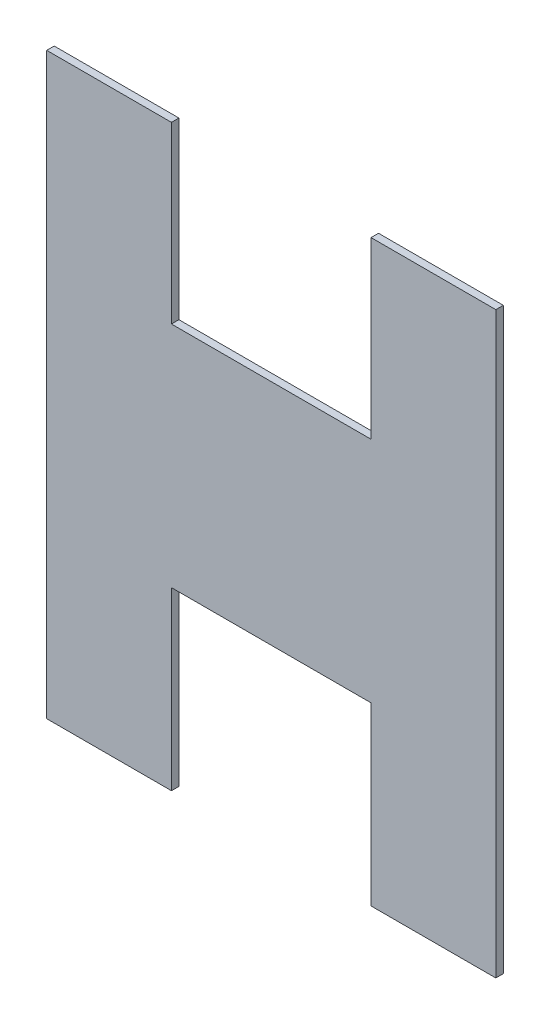
ISO-10303-21;
HEADER;
FILE_DESCRIPTION(('STEP AP214'),'2;1');
FILE_NAME('part.step','',(''),(''),'','','');
FILE_SCHEMA(('AUTOMOTIVE_DESIGN { 1 0 10303 214 1 1 1 1 }'));
ENDSEC;
DATA;
#1=APPLICATION_CONTEXT('core data for automotive mechanical design processes');
#2=APPLICATION_PROTOCOL_DEFINITION('international standard','automotive_design',2000,#1);
#3=PRODUCT_CONTEXT('',#1,'mechanical');
#4=PRODUCT('Part','Part','',(#3));
#5=PRODUCT_RELATED_PRODUCT_CATEGORY('part','',(#4));
#6=PRODUCT_DEFINITION_FORMATION('','',#4);
#7=PRODUCT_DEFINITION_CONTEXT('part definition',#1,'design');
#8=PRODUCT_DEFINITION('design','',#6,#7);
#9=PRODUCT_DEFINITION_SHAPE('','',#8);
#10=(LENGTH_UNIT() NAMED_UNIT(*) SI_UNIT(.MILLI.,.METRE.));
#11=(NAMED_UNIT(*) PLANE_ANGLE_UNIT() SI_UNIT($,.RADIAN.));
#12=(NAMED_UNIT(*) SI_UNIT($,.STERADIAN.) SOLID_ANGLE_UNIT());
#13=UNCERTAINTY_MEASURE_WITH_UNIT(LENGTH_MEASURE(1.E-05),#10,'distance_accuracy_value','');
#14=(GEOMETRIC_REPRESENTATION_CONTEXT(3) GLOBAL_UNCERTAINTY_ASSIGNED_CONTEXT((#13)) GLOBAL_UNIT_ASSIGNED_CONTEXT((#10,
#11,#12)) REPRESENTATION_CONTEXT('',''));
#15=CARTESIAN_POINT('',(0.,0.,0.));
#16=DIRECTION('',(0.,0.,1.));
#17=DIRECTION('',(1.,0.,0.));
#18=AXIS2_PLACEMENT_3D('',#15,#16,#17);
#19=CARTESIAN_POINT('',(40.,83.2564363110963,3.));
#20=DIRECTION('',(0.,-1.,0.));
#21=DIRECTION('',(1.,0.,0.));
#22=AXIS2_PLACEMENT_3D('',#19,#20,#21);
#23=PLANE('',#22);
#24=DIRECTION('',(-1.,0.,0.));
#25=VECTOR('',#24,1.);
#26=CARTESIAN_POINT('',(40.,83.2564363110963,0.));
#27=LINE('',#26,#25);
#28=CARTESIAN_POINT('',(90.,83.2564363110963,0.));
#29=VERTEX_POINT('',#28);
#30=CARTESIAN_POINT('',(40.,83.2564363110963,0.));
#31=VERTEX_POINT('',#30);
#32=EDGE_CURVE('E153',#29,#31,#27,.T.);
#33=ORIENTED_EDGE('',*,*,#32,.T.);
#34=DIRECTION('',(0.,0.,-1.));
#35=VECTOR('',#34,1.);
#36=CARTESIAN_POINT('',(40.,83.2564363110963,3.));
#37=LINE('',#36,#35);
#38=CARTESIAN_POINT('',(40.,83.2564363110963,3.));
#39=VERTEX_POINT('',#38);
#40=EDGE_CURVE('E11',#39,#31,#37,.T.);
#41=ORIENTED_EDGE('',*,*,#40,.F.);
#42=DIRECTION('',(-1.,0.,0.));
#43=VECTOR('',#42,1.);
#44=CARTESIAN_POINT('',(40.,83.2564363110963,3.));
#45=LINE('',#44,#43);
#46=CARTESIAN_POINT('',(90.,83.2564363110963,3.));
#47=VERTEX_POINT('',#46);
#48=EDGE_CURVE('E175',#47,#39,#45,.T.);
#49=ORIENTED_EDGE('',*,*,#48,.F.);
#50=DIRECTION('',(0.,0.,-1.));
#51=VECTOR('',#50,1.);
#52=CARTESIAN_POINT('',(90.,83.2564363110963,3.));
#53=LINE('',#52,#51);
#54=EDGE_CURVE('E149',#47,#29,#53,.T.);
#55=ORIENTED_EDGE('',*,*,#54,.T.);
#56=EDGE_LOOP('',(#33,#41,#49,#55));
#57=FACE_BOUND('',#56,.T.);
#58=ADVANCED_FACE('F33',(#57),#23,.F.);
#59=CARTESIAN_POINT('',(40.,13.2564363110963,3.));
#60=DIRECTION('',(1.,0.,0.));
#61=DIRECTION('',(0.,0.,-1.));
#62=AXIS2_PLACEMENT_3D('',#59,#60,#61);
#63=PLANE('',#62);
#64=DIRECTION('',(0.,-1.,0.));
#65=VECTOR('',#64,1.);
#66=CARTESIAN_POINT('',(40.,13.2564363110963,0.));
#67=LINE('',#66,#65);
#68=CARTESIAN_POINT('',(40.,13.2564363110963,0.));
#69=VERTEX_POINT('',#68);
#70=EDGE_CURVE('E156',#31,#69,#67,.T.);
#71=ORIENTED_EDGE('',*,*,#70,.T.);
#72=DIRECTION('',(0.,0.,-1.));
#73=VECTOR('',#72,1.);
#74=CARTESIAN_POINT('',(40.,13.2564363110963,3.));
#75=LINE('',#74,#73);
#76=CARTESIAN_POINT('',(40.,13.2564363110963,3.));
#77=VERTEX_POINT('',#76);
#78=EDGE_CURVE('E41',#77,#69,#75,.T.);
#79=ORIENTED_EDGE('',*,*,#78,.F.);
#80=DIRECTION('',(0.,-1.,0.));
#81=VECTOR('',#80,1.);
#82=CARTESIAN_POINT('',(40.,13.2564363110963,3.));
#83=LINE('',#82,#81);
#84=EDGE_CURVE('E104',#39,#77,#83,.T.);
#85=ORIENTED_EDGE('',*,*,#84,.F.);
#86=ORIENTED_EDGE('',*,*,#40,.T.);
#87=EDGE_LOOP('',(#71,#79,#85,#86));
#88=FACE_BOUND('',#87,.T.);
#89=ADVANCED_FACE('F253',(#88),#63,.F.);
#90=CARTESIAN_POINT('',(-40.,13.2564363110963,3.));
#91=DIRECTION('',(0.,-1.,0.));
#92=DIRECTION('',(0.,0.,-1.));
#93=AXIS2_PLACEMENT_3D('',#90,#91,#92);
#94=PLANE('',#93);
#95=DIRECTION('',(-1.,0.,0.));
#96=VECTOR('',#95,1.);
#97=CARTESIAN_POINT('',(-40.,13.2564363110963,0.));
#98=LINE('',#97,#96);
#99=CARTESIAN_POINT('',(-40.,13.2564363110963,0.));
#100=VERTEX_POINT('',#99);
#101=EDGE_CURVE('E158',#69,#100,#98,.T.);
#102=ORIENTED_EDGE('',*,*,#101,.T.);
#103=DIRECTION('',(0.,0.,-1.));
#104=VECTOR('',#103,1.);
#105=CARTESIAN_POINT('',(-40.,13.2564363110963,3.));
#106=LINE('',#105,#104);
#107=CARTESIAN_POINT('',(-40.,13.2564363110963,3.));
#108=VERTEX_POINT('',#107);
#109=EDGE_CURVE('E194',#108,#100,#106,.T.);
#110=ORIENTED_EDGE('',*,*,#109,.F.);
#111=DIRECTION('',(-1.,0.,0.));
#112=VECTOR('',#111,1.);
#113=CARTESIAN_POINT('',(-40.,13.2564363110963,3.));
#114=LINE('',#113,#112);
#115=EDGE_CURVE('E202',#77,#108,#114,.T.);
#116=ORIENTED_EDGE('',*,*,#115,.F.);
#117=ORIENTED_EDGE('',*,*,#78,.T.);
#118=EDGE_LOOP('',(#102,#110,#116,#117));
#119=FACE_BOUND('',#118,.T.);
#120=ADVANCED_FACE('F200',(#119),#94,.F.);
#121=CARTESIAN_POINT('',(-40.,83.2564363110963,3.));
#122=DIRECTION('',(-1.,0.,0.));
#123=DIRECTION('',(0.,0.,1.));
#124=AXIS2_PLACEMENT_3D('',#121,#122,#123);
#125=PLANE('',#124);
#126=DIRECTION('',(0.,1.,0.));
#127=VECTOR('',#126,1.);
#128=CARTESIAN_POINT('',(-40.,83.2564363110963,0.));
#129=LINE('',#128,#127);
#130=CARTESIAN_POINT('',(-40.,83.2564363110963,0.));
#131=VERTEX_POINT('',#130);
#132=EDGE_CURVE('E160',#100,#131,#129,.T.);
#133=ORIENTED_EDGE('',*,*,#132,.T.);
#134=DIRECTION('',(0.,0.,-1.));
#135=VECTOR('',#134,1.);
#136=CARTESIAN_POINT('',(-40.,83.2564363110963,3.));
#137=LINE('',#136,#135);
#138=CARTESIAN_POINT('',(-40.,83.2564363110963,3.));
#139=VERTEX_POINT('',#138);
#140=EDGE_CURVE('E191',#139,#131,#137,.T.);
#141=ORIENTED_EDGE('',*,*,#140,.F.);
#142=DIRECTION('',(0.,1.,0.));
#143=VECTOR('',#142,1.);
#144=CARTESIAN_POINT('',(-40.,83.2564363110963,3.));
#145=LINE('',#144,#143);
#146=EDGE_CURVE('E220',#108,#139,#145,.T.);
#147=ORIENTED_EDGE('',*,*,#146,.F.);
#148=ORIENTED_EDGE('',*,*,#109,.T.);
#149=EDGE_LOOP('',(#133,#141,#147,#148));
#150=FACE_BOUND('',#149,.T.);
#151=ADVANCED_FACE('F211',(#150),#125,.F.);
#152=CARTESIAN_POINT('',(-90.,83.2564363110963,3.));
#153=DIRECTION('',(0.,-1.,0.));
#154=DIRECTION('',(1.,0.,0.));
#155=AXIS2_PLACEMENT_3D('',#152,#153,#154);
#156=PLANE('',#155);
#157=DIRECTION('',(-1.,0.,0.));
#158=VECTOR('',#157,1.);
#159=CARTESIAN_POINT('',(-90.,83.2564363110963,0.));
#160=LINE('',#159,#158);
#161=CARTESIAN_POINT('',(-90.,83.2564363110963,0.));
#162=VERTEX_POINT('',#161);
#163=EDGE_CURVE('E162',#131,#162,#160,.T.);
#164=ORIENTED_EDGE('',*,*,#163,.T.);
#165=DIRECTION('',(0.,0.,-1.));
#166=VECTOR('',#165,1.);
#167=CARTESIAN_POINT('',(-90.,83.2564363110963,3.));
#168=LINE('',#167,#166);
#169=CARTESIAN_POINT('',(-90.,83.2564363110963,3.));
#170=VERTEX_POINT('',#169);
#171=EDGE_CURVE('E188',#170,#162,#168,.T.);
#172=ORIENTED_EDGE('',*,*,#171,.F.);
#173=DIRECTION('',(-1.,0.,0.));
#174=VECTOR('',#173,1.);
#175=CARTESIAN_POINT('',(-90.,83.2564363110963,3.));
#176=LINE('',#175,#174);
#177=EDGE_CURVE('E217',#139,#170,#176,.T.);
#178=ORIENTED_EDGE('',*,*,#177,.F.);
#179=ORIENTED_EDGE('',*,*,#140,.T.);
#180=EDGE_LOOP('',(#164,#172,#178,#179));
#181=FACE_BOUND('',#180,.T.);
#182=ADVANCED_FACE('F215',(#181),#156,.F.);
#183=CARTESIAN_POINT('',(-90.,-148.743563688904,3.));
#184=DIRECTION('',(1.,0.,0.));
#185=DIRECTION('',(0.,1.,0.));
#186=AXIS2_PLACEMENT_3D('',#183,#184,#185);
#187=PLANE('',#186);
#188=DIRECTION('',(0.,-1.,0.));
#189=VECTOR('',#188,1.);
#190=CARTESIAN_POINT('',(-90.,-148.743563688904,0.));
#191=LINE('',#190,#189);
#192=CARTESIAN_POINT('',(-90.,-148.743563688904,0.));
#193=VERTEX_POINT('',#192);
#194=EDGE_CURVE('E164',#162,#193,#191,.T.);
#195=ORIENTED_EDGE('',*,*,#194,.T.);
#196=DIRECTION('',(0.,0.,-1.));
#197=VECTOR('',#196,1.);
#198=CARTESIAN_POINT('',(-90.,-148.743563688904,3.));
#199=LINE('',#198,#197);
#200=CARTESIAN_POINT('',(-90.,-148.743563688904,3.));
#201=VERTEX_POINT('',#200);
#202=EDGE_CURVE('E185',#201,#193,#199,.T.);
#203=ORIENTED_EDGE('',*,*,#202,.F.);
#204=DIRECTION('',(0.,-1.,0.));
#205=VECTOR('',#204,1.);
#206=CARTESIAN_POINT('',(-90.,-148.743563688904,3.));
#207=LINE('',#206,#205);
#208=EDGE_CURVE('E219',#170,#201,#207,.T.);
#209=ORIENTED_EDGE('',*,*,#208,.F.);
#210=ORIENTED_EDGE('',*,*,#171,.T.);
#211=EDGE_LOOP('',(#195,#203,#209,#210));
#212=FACE_BOUND('',#211,.T.);
#213=ADVANCED_FACE('F266',(#212),#187,.F.);
#214=CARTESIAN_POINT('',(-40.,-148.743563688904,3.));
#215=DIRECTION('',(0.,1.,0.));
#216=DIRECTION('',(0.,0.,1.));
#217=AXIS2_PLACEMENT_3D('',#214,#215,#216);
#218=PLANE('',#217);
#219=DIRECTION('',(1.,0.,0.));
#220=VECTOR('',#219,1.);
#221=CARTESIAN_POINT('',(-40.,-148.743563688904,0.));
#222=LINE('',#221,#220);
#223=CARTESIAN_POINT('',(-40.,-148.743563688904,0.));
#224=VERTEX_POINT('',#223);
#225=EDGE_CURVE('E166',#193,#224,#222,.T.);
#226=ORIENTED_EDGE('',*,*,#225,.T.);
#227=DIRECTION('',(0.,0.,-1.));
#228=VECTOR('',#227,1.);
#229=CARTESIAN_POINT('',(-40.,-148.743563688904,3.));
#230=LINE('',#229,#228);
#231=CARTESIAN_POINT('',(-40.,-148.743563688904,3.));
#232=VERTEX_POINT('',#231);
#233=EDGE_CURVE('E182',#232,#224,#230,.T.);
#234=ORIENTED_EDGE('',*,*,#233,.F.);
#235=DIRECTION('',(1.,0.,0.));
#236=VECTOR('',#235,1.);
#237=CARTESIAN_POINT('',(-40.,-148.743563688904,3.));
#238=LINE('',#237,#236);
#239=EDGE_CURVE('E222',#201,#232,#238,.T.);
#240=ORIENTED_EDGE('',*,*,#239,.F.);
#241=ORIENTED_EDGE('',*,*,#202,.T.);
#242=EDGE_LOOP('',(#226,#234,#240,#241));
#243=FACE_BOUND('',#242,.T.);
#244=ADVANCED_FACE('F269',(#243),#218,.F.);
#245=CARTESIAN_POINT('',(-40.,-148.743563688904,3.));
#246=DIRECTION('',(-1.,0.,0.));
#247=DIRECTION('',(0.,-1.,0.));
#248=AXIS2_PLACEMENT_3D('',#245,#246,#247);
#249=PLANE('',#248);
#250=DIRECTION('',(0.,1.,0.));
#251=VECTOR('',#250,1.);
#252=CARTESIAN_POINT('',(-40.,-148.743563688904,0.));
#253=LINE('',#252,#251);
#254=CARTESIAN_POINT('',(-40.,-78.2435636889036,0.));
#255=VERTEX_POINT('',#254);
#256=EDGE_CURVE('E168',#224,#255,#253,.T.);
#257=ORIENTED_EDGE('',*,*,#256,.T.);
#258=DIRECTION('',(0.,0.,-1.));
#259=VECTOR('',#258,1.);
#260=CARTESIAN_POINT('',(-40.,-78.2435636889036,3.));
#261=LINE('',#260,#259);
#262=CARTESIAN_POINT('',(-40.,-78.2435636889036,3.));
#263=VERTEX_POINT('',#262);
#264=EDGE_CURVE('E179',#263,#255,#261,.T.);
#265=ORIENTED_EDGE('',*,*,#264,.F.);
#266=DIRECTION('',(0.,1.,0.));
#267=VECTOR('',#266,1.);
#268=CARTESIAN_POINT('',(-40.,-148.743563688904,3.));
#269=LINE('',#268,#267);
#270=EDGE_CURVE('E228',#232,#263,#269,.T.);
#271=ORIENTED_EDGE('',*,*,#270,.F.);
#272=ORIENTED_EDGE('',*,*,#233,.T.);
#273=EDGE_LOOP('',(#257,#265,#271,#272));
#274=FACE_BOUND('',#273,.T.);
#275=ADVANCED_FACE('F234',(#274),#249,.F.);
#276=CARTESIAN_POINT('',(-40.,-78.2435636889036,3.));
#277=DIRECTION('',(0.,1.,0.));
#278=DIRECTION('',(0.,0.,1.));
#279=AXIS2_PLACEMENT_3D('',#276,#277,#278);
#280=PLANE('',#279);
#281=DIRECTION('',(1.,0.,0.));
#282=VECTOR('',#281,1.);
#283=CARTESIAN_POINT('',(-40.,-78.2435636889036,0.));
#284=LINE('',#283,#282);
#285=CARTESIAN_POINT('',(40.,-78.2435636889036,0.));
#286=VERTEX_POINT('',#285);
#287=EDGE_CURVE('E170',#255,#286,#284,.T.);
#288=ORIENTED_EDGE('',*,*,#287,.T.);
#289=DIRECTION('',(0.,0.,-1.));
#290=VECTOR('',#289,1.);
#291=CARTESIAN_POINT('',(40.,-78.2435636889036,3.));
#292=LINE('',#291,#290);
#293=CARTESIAN_POINT('',(40.,-78.2435636889036,3.));
#294=VERTEX_POINT('',#293);
#295=EDGE_CURVE('E144',#294,#286,#292,.T.);
#296=ORIENTED_EDGE('',*,*,#295,.F.);
#297=DIRECTION('',(1.,0.,0.));
#298=VECTOR('',#297,1.);
#299=CARTESIAN_POINT('',(-40.,-78.2435636889036,3.));
#300=LINE('',#299,#298);
#301=EDGE_CURVE('E135',#263,#294,#300,.T.);
#302=ORIENTED_EDGE('',*,*,#301,.F.);
#303=ORIENTED_EDGE('',*,*,#264,.T.);
#304=EDGE_LOOP('',(#288,#296,#302,#303));
#305=FACE_BOUND('',#304,.T.);
#306=ADVANCED_FACE('F238',(#305),#280,.F.);
#307=CARTESIAN_POINT('',(40.,-78.2435636889036,3.));
#308=DIRECTION('',(1.,0.,0.));
#309=DIRECTION('',(0.,1.,0.));
#310=AXIS2_PLACEMENT_3D('',#307,#308,#309);
#311=PLANE('',#310);
#312=DIRECTION('',(0.,-1.,0.));
#313=VECTOR('',#312,1.);
#314=CARTESIAN_POINT('',(40.,-78.2435636889036,0.));
#315=LINE('',#314,#313);
#316=CARTESIAN_POINT('',(40.,-148.743563688904,0.));
#317=VERTEX_POINT('',#316);
#318=EDGE_CURVE('E143',#286,#317,#315,.T.);
#319=ORIENTED_EDGE('',*,*,#318,.T.);
#320=DIRECTION('',(0.,0.,-1.));
#321=VECTOR('',#320,1.);
#322=CARTESIAN_POINT('',(40.,-148.743563688904,3.));
#323=LINE('',#322,#321);
#324=CARTESIAN_POINT('',(40.,-148.743563688904,3.));
#325=VERTEX_POINT('',#324);
#326=EDGE_CURVE('E140',#325,#317,#323,.T.);
#327=ORIENTED_EDGE('',*,*,#326,.F.);
#328=DIRECTION('',(0.,-1.,0.));
#329=VECTOR('',#328,1.);
#330=CARTESIAN_POINT('',(40.,-78.2435636889036,3.));
#331=LINE('',#330,#329);
#332=EDGE_CURVE('E129',#294,#325,#331,.T.);
#333=ORIENTED_EDGE('',*,*,#332,.F.);
#334=ORIENTED_EDGE('',*,*,#295,.T.);
#335=EDGE_LOOP('',(#319,#327,#333,#334));
#336=FACE_BOUND('',#335,.T.);
#337=ADVANCED_FACE('F141',(#336),#311,.F.);
#338=CARTESIAN_POINT('',(90.,-148.743563688904,3.));
#339=DIRECTION('',(0.,1.,0.));
#340=DIRECTION('',(0.,0.,1.));
#341=AXIS2_PLACEMENT_3D('',#338,#339,#340);
#342=PLANE('',#341);
#343=DIRECTION('',(1.,0.,0.));
#344=VECTOR('',#343,1.);
#345=CARTESIAN_POINT('',(90.,-148.743563688904,0.));
#346=LINE('',#345,#344);
#347=CARTESIAN_POINT('',(90.,-148.743563688904,0.));
#348=VERTEX_POINT('',#347);
#349=EDGE_CURVE('E90',#317,#348,#346,.T.);
#350=ORIENTED_EDGE('',*,*,#349,.T.);
#351=DIRECTION('',(0.,0.,-1.));
#352=VECTOR('',#351,1.);
#353=CARTESIAN_POINT('',(90.,-148.743563688904,3.));
#354=LINE('',#353,#352);
#355=CARTESIAN_POINT('',(90.,-148.743563688904,3.));
#356=VERTEX_POINT('',#355);
#357=EDGE_CURVE('E145',#356,#348,#354,.T.);
#358=ORIENTED_EDGE('',*,*,#357,.F.);
#359=DIRECTION('',(1.,0.,0.));
#360=VECTOR('',#359,1.);
#361=CARTESIAN_POINT('',(90.,-148.743563688904,3.));
#362=LINE('',#361,#360);
#363=EDGE_CURVE('E133',#325,#356,#362,.T.);
#364=ORIENTED_EDGE('',*,*,#363,.F.);
#365=ORIENTED_EDGE('',*,*,#326,.T.);
#366=EDGE_LOOP('',(#350,#358,#364,#365));
#367=FACE_BOUND('',#366,.T.);
#368=ADVANCED_FACE('F147',(#367),#342,.F.);
#369=CARTESIAN_POINT('',(90.,83.2564363110963,3.));
#370=DIRECTION('',(-1.,0.,0.));
#371=DIRECTION('',(0.,-1.,0.));
#372=AXIS2_PLACEMENT_3D('',#369,#370,#371);
#373=PLANE('',#372);
#374=DIRECTION('',(0.,1.,0.));
#375=VECTOR('',#374,1.);
#376=CARTESIAN_POINT('',(90.,83.2564363110963,0.));
#377=LINE('',#376,#375);
#378=EDGE_CURVE('E96',#348,#29,#377,.T.);
#379=ORIENTED_EDGE('',*,*,#378,.T.);
#380=ORIENTED_EDGE('',*,*,#54,.F.);
#381=DIRECTION('',(0.,1.,0.));
#382=VECTOR('',#381,1.);
#383=CARTESIAN_POINT('',(90.,83.2564363110963,3.));
#384=LINE('',#383,#382);
#385=EDGE_CURVE('E49',#356,#47,#384,.T.);
#386=ORIENTED_EDGE('',*,*,#385,.F.);
#387=ORIENTED_EDGE('',*,*,#357,.T.);
#388=EDGE_LOOP('',(#379,#380,#386,#387));
#389=FACE_BOUND('',#388,.T.);
#390=ADVANCED_FACE('F242',(#389),#373,.F.);
#391=CARTESIAN_POINT('',(0.,0.,3.));
#392=DIRECTION('',(0.,0.,-1.));
#393=DIRECTION('',(-1.,0.,0.));
#394=AXIS2_PLACEMENT_3D('',#391,#392,#393);
#395=PLANE('',#394);
#396=ORIENTED_EDGE('',*,*,#48,.T.);
#397=ORIENTED_EDGE('',*,*,#84,.T.);
#398=ORIENTED_EDGE('',*,*,#115,.T.);
#399=ORIENTED_EDGE('',*,*,#146,.T.);
#400=ORIENTED_EDGE('',*,*,#177,.T.);
#401=ORIENTED_EDGE('',*,*,#208,.T.);
#402=ORIENTED_EDGE('',*,*,#239,.T.);
#403=ORIENTED_EDGE('',*,*,#270,.T.);
#404=ORIENTED_EDGE('',*,*,#301,.T.);
#405=ORIENTED_EDGE('',*,*,#332,.T.);
#406=ORIENTED_EDGE('',*,*,#363,.T.);
#407=ORIENTED_EDGE('',*,*,#385,.T.);
#408=EDGE_LOOP('',(#396,#397,#398,#399,#400,#401,#402,#403,#404,#405,#406,#407));
#409=FACE_BOUND('',#408,.T.);
#410=ADVANCED_FACE('F131',(#409),#395,.F.);
#411=CARTESIAN_POINT('',(0.,0.,0.));
#412=DIRECTION('',(0.,0.,-1.));
#413=DIRECTION('',(-1.,0.,0.));
#414=AXIS2_PLACEMENT_3D('',#411,#412,#413);
#415=PLANE('',#414);
#416=ORIENTED_EDGE('',*,*,#32,.F.);
#417=ORIENTED_EDGE('',*,*,#378,.F.);
#418=ORIENTED_EDGE('',*,*,#349,.F.);
#419=ORIENTED_EDGE('',*,*,#318,.F.);
#420=ORIENTED_EDGE('',*,*,#287,.F.);
#421=ORIENTED_EDGE('',*,*,#256,.F.);
#422=ORIENTED_EDGE('',*,*,#225,.F.);
#423=ORIENTED_EDGE('',*,*,#194,.F.);
#424=ORIENTED_EDGE('',*,*,#163,.F.);
#425=ORIENTED_EDGE('',*,*,#132,.F.);
#426=ORIENTED_EDGE('',*,*,#101,.F.);
#427=ORIENTED_EDGE('',*,*,#70,.F.);
#428=EDGE_LOOP('',(#416,#417,#418,#419,#420,#421,#422,#423,#424,#425,#426,#427));
#429=FACE_BOUND('',#428,.T.);
#430=ADVANCED_FACE('F206',(#429),#415,.T.);
#431=CLOSED_SHELL('',(#58,#89,#120,#151,#182,#213,#244,#275,#306,#337,#368,#390,#410,#430));
#432=MANIFOLD_SOLID_BREP('B2',#431);
#433=ADVANCED_BREP_SHAPE_REPRESENTATION('',(#18,#432),#14);
#434=SHAPE_DEFINITION_REPRESENTATION(#9,#433);
ENDSEC;
END-ISO-10303-21;
